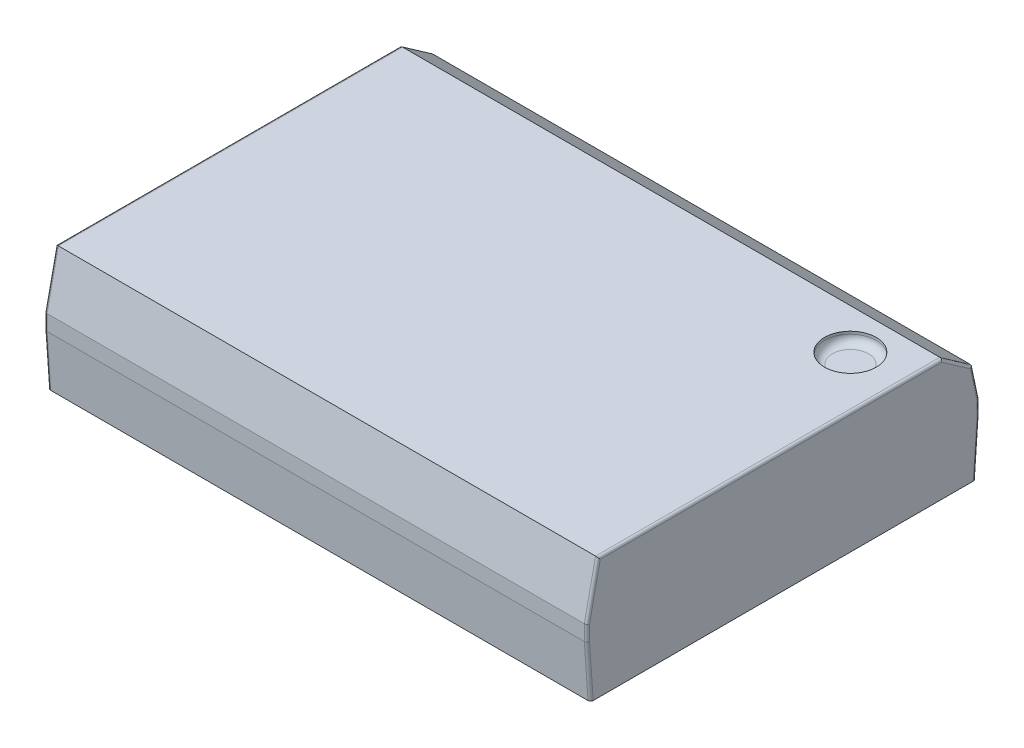
ISO-10303-21;
HEADER;
FILE_DESCRIPTION(('STEP AP214'),'2;1');
FILE_NAME('part.step','',(''),(''),'','','');
FILE_SCHEMA(('AUTOMOTIVE_DESIGN { 1 0 10303 214 1 1 1 1 }'));
ENDSEC;
DATA;
#1=APPLICATION_CONTEXT('core data for automotive mechanical design processes');
#2=APPLICATION_PROTOCOL_DEFINITION('international standard','automotive_design',2000,#1);
#3=PRODUCT_CONTEXT('',#1,'mechanical');
#4=PRODUCT('Part','Part','',(#3));
#5=PRODUCT_RELATED_PRODUCT_CATEGORY('part','',(#4));
#6=PRODUCT_DEFINITION_FORMATION('','',#4);
#7=PRODUCT_DEFINITION_CONTEXT('part definition',#1,'design');
#8=PRODUCT_DEFINITION('design','',#6,#7);
#9=PRODUCT_DEFINITION_SHAPE('','',#8);
#10=(LENGTH_UNIT() NAMED_UNIT(*) SI_UNIT(.MILLI.,.METRE.));
#11=(NAMED_UNIT(*) PLANE_ANGLE_UNIT() SI_UNIT($,.RADIAN.));
#12=(NAMED_UNIT(*) SI_UNIT($,.STERADIAN.) SOLID_ANGLE_UNIT());
#13=UNCERTAINTY_MEASURE_WITH_UNIT(LENGTH_MEASURE(1.E-05),#10,'distance_accuracy_value','');
#14=(GEOMETRIC_REPRESENTATION_CONTEXT(3) GLOBAL_UNCERTAINTY_ASSIGNED_CONTEXT((#13)) GLOBAL_UNIT_ASSIGNED_CONTEXT((#10,
#11,#12)) REPRESENTATION_CONTEXT('',''));
#15=CARTESIAN_POINT('',(0.,0.,0.));
#16=DIRECTION('',(0.,0.,1.));
#17=DIRECTION('',(1.,0.,0.));
#18=AXIS2_PLACEMENT_3D('',#15,#16,#17);
#19=CARTESIAN_POINT('',(4.25,0.975,-2.3));
#20=DIRECTION('',(0.,1.,0.));
#21=DIRECTION('',(0.,0.,1.));
#22=AXIS2_PLACEMENT_3D('',#19,#20,#21);
#23=PLANE('',#22);
#24=CARTESIAN_POINT('',(4.25,0.975,-2.3));
#25=DIRECTION('',(0.,-1.,0.));
#26=DIRECTION('',(0.,0.,-1.));
#27=AXIS2_PLACEMENT_3D('',#24,#25,#26);
#28=CIRCLE('',#27,0.350000000000003);
#29=CARTESIAN_POINT('',(4.25,0.975,-1.95));
#30=VERTEX_POINT('',#29);
#31=CARTESIAN_POINT('',(4.25,0.975,-2.65));
#32=VERTEX_POINT('',#31);
#33=EDGE_CURVE('E286',#30,#32,#28,.F.);
#34=ORIENTED_EDGE('',*,*,#33,.T.);
#35=CARTESIAN_POINT('',(4.25,0.975,-2.3));
#36=DIRECTION('',(0.,-1.,0.));
#37=DIRECTION('',(0.,0.,1.));
#38=AXIS2_PLACEMENT_3D('',#35,#36,#37);
#39=CIRCLE('',#38,0.350000000000002);
#40=EDGE_CURVE('E288',#32,#30,#39,.F.);
#41=ORIENTED_EDGE('',*,*,#40,.T.);
#42=EDGE_LOOP('',(#34,#41));
#43=FACE_BOUND('',#42,.T.);
#44=ADVANCED_FACE('F17',(#43),#23,.T.);
#45=CARTESIAN_POINT('',(4.25,1.125,-2.3));
#46=DIRECTION('',(0.,1.,0.));
#47=DIRECTION('',(0.,0.,1.));
#48=AXIS2_PLACEMENT_3D('',#45,#46,#47);
#49=TOROIDAL_SURFACE('',#48,0.350000000000003,0.15);
#50=CARTESIAN_POINT('',(4.25,1.125,-2.3));
#51=DIRECTION('',(0.,1.,0.));
#52=DIRECTION('',(0.,0.,1.));
#53=AXIS2_PLACEMENT_3D('',#50,#51,#52);
#54=CIRCLE('',#53,0.500000000000003);
#55=CARTESIAN_POINT('',(4.25,1.125,-1.8));
#56=VERTEX_POINT('',#55);
#57=EDGE_CURVE('E202',#56,#56,#54,.T.);
#58=ORIENTED_EDGE('',*,*,#57,.T.);
#59=EDGE_LOOP('',(#58));
#60=FACE_BOUND('',#59,.T.);
#61=ORIENTED_EDGE('',*,*,#40,.F.);
#62=ORIENTED_EDGE('',*,*,#33,.F.);
#63=EDGE_LOOP('',(#61,#62));
#64=FACE_BOUND('',#63,.T.);
#65=ADVANCED_FACE('F206',(#60,#64),#49,.F.);
#66=CARTESIAN_POINT('',(4.25,0.975,-2.3));
#67=DIRECTION('',(0.,1.,0.));
#68=DIRECTION('',(0.,0.,1.));
#69=AXIS2_PLACEMENT_3D('',#66,#67,#68);
#70=CYLINDRICAL_SURFACE('',#69,0.500000000000003);
#71=CARTESIAN_POINT('',(4.25,1.175,-2.3));
#72=DIRECTION('',(0.,1.,0.));
#73=DIRECTION('',(0.,0.,1.));
#74=AXIS2_PLACEMENT_3D('',#71,#72,#73);
#75=CIRCLE('',#74,0.500000000000003);
#76=CARTESIAN_POINT('',(4.25,1.175,-1.8));
#77=VERTEX_POINT('',#76);
#78=EDGE_CURVE('E189',#77,#77,#75,.F.);
#79=ORIENTED_EDGE('',*,*,#78,.F.);
#80=EDGE_LOOP('',(#79));
#81=FACE_BOUND('',#80,.T.);
#82=ORIENTED_EDGE('',*,*,#57,.F.);
#83=EDGE_LOOP('',(#82));
#84=FACE_BOUND('',#83,.T.);
#85=ADVANCED_FACE('F210',(#81,#84),#70,.F.);
#86=CARTESIAN_POINT('',(-5.25,1.175,-3.08212952428822));
#87=DIRECTION('',(0.,0.819152044288993,-0.573576436351044));
#88=DIRECTION('',(0.,0.573576436351044,0.819152044288993));
#89=AXIS2_PLACEMENT_3D('',#86,#87,#88);
#90=PLANE('',#89);
#91=DIRECTION('',(1.,0.,0.));
#92=VECTOR('',#91,1.);
#93=CARTESIAN_POINT('',(-5.25,1.175,-3.08212952428822));
#94=LINE('',#93,#92);
#95=CARTESIAN_POINT('',(5.2,1.175,-3.08212952428822));
#96=VERTEX_POINT('',#95);
#97=CARTESIAN_POINT('',(-5.2,1.175,-3.08212952428822));
#98=VERTEX_POINT('',#97);
#99=EDGE_CURVE('E186',#96,#98,#94,.F.);
#100=ORIENTED_EDGE('',*,*,#99,.F.);
#101=DIRECTION('',(0.,0.573576436351044,0.819152044288993));
#102=VECTOR('',#101,1.);
#103=CARTESIAN_POINT('',(5.2,1.175,-3.08212952428822));
#104=LINE('',#103,#102);
#105=CARTESIAN_POINT('',(5.2,0.763677592272503,-3.66955880101262));
#106=VERTEX_POINT('',#105);
#107=EDGE_CURVE('E197',#96,#106,#104,.F.);
#108=ORIENTED_EDGE('',*,*,#107,.T.);
#109=DIRECTION('',(1.,0.,0.));
#110=VECTOR('',#109,1.);
#111=CARTESIAN_POINT('',(-5.25,0.763677592272503,-3.66955880101262));
#112=LINE('',#111,#110);
#113=CARTESIAN_POINT('',(-5.2,0.763677592272503,-3.66955880101262));
#114=VERTEX_POINT('',#113);
#115=EDGE_CURVE('E194',#106,#114,#112,.F.);
#116=ORIENTED_EDGE('',*,*,#115,.T.);
#117=DIRECTION('',(0.,0.573576436351044,0.819152044288993));
#118=VECTOR('',#117,1.);
#119=CARTESIAN_POINT('',(-5.2,1.175,-3.08212952428822));
#120=LINE('',#119,#118);
#121=EDGE_CURVE('E200',#114,#98,#120,.T.);
#122=ORIENTED_EDGE('',*,*,#121,.T.);
#123=EDGE_LOOP('',(#100,#108,#116,#122));
#124=FACE_BOUND('',#123,.T.);
#125=ADVANCED_FACE('F310',(#124),#90,.T.);
#126=CARTESIAN_POINT('',(-5.25,1.175,-3.58212952428823));
#127=DIRECTION('',(0.,-0.207911690817756,0.978147600733806));
#128=DIRECTION('',(0.,-0.978147600733806,-0.207911690817756));
#129=AXIS2_PLACEMENT_3D('',#126,#127,#128);
#130=PLANE('',#129);
#131=DIRECTION('',(0.,-0.978147600733806,-0.207911690817756));
#132=VECTOR('',#131,1.);
#133=CARTESIAN_POINT('',(-5.2,1.175,-3.58212952428823));
#134=LINE('',#133,#132);
#135=CARTESIAN_POINT('',(-5.2,0.149999999999984,-3.8));
#136=VERTEX_POINT('',#135);
#137=EDGE_CURVE('E192',#114,#136,#134,.T.);
#138=ORIENTED_EDGE('',*,*,#137,.F.);
#139=ORIENTED_EDGE('',*,*,#115,.F.);
#140=DIRECTION('',(0.,-0.978147600733806,-0.207911690817756));
#141=VECTOR('',#140,1.);
#142=CARTESIAN_POINT('',(5.2,-1.11772386568823,-4.06946302603771));
#143=LINE('',#142,#141);
#144=CARTESIAN_POINT('',(5.2,0.149999999999983,-3.8));
#145=VERTEX_POINT('',#144);
#146=EDGE_CURVE('E159',#145,#106,#143,.F.);
#147=ORIENTED_EDGE('',*,*,#146,.F.);
#148=DIRECTION('',(-1.,0.,0.));
#149=VECTOR('',#148,1.);
#150=CARTESIAN_POINT('',(-5.25,0.149999999999983,-3.8));
#151=LINE('',#150,#149);
#152=EDGE_CURVE('E181',#136,#145,#151,.F.);
#153=ORIENTED_EDGE('',*,*,#152,.F.);
#154=EDGE_LOOP('',(#138,#139,#147,#153));
#155=FACE_BOUND('',#154,.T.);
#156=ADVANCED_FACE('F316',(#155),#130,.F.);
#157=CARTESIAN_POINT('',(-5.25,1.175,3.8));
#158=DIRECTION('',(0.,1.,0.));
#159=DIRECTION('',(0.,0.,1.));
#160=AXIS2_PLACEMENT_3D('',#157,#158,#159);
#161=PLANE('',#160);
#162=DIRECTION('',(1.,0.,0.));
#163=VECTOR('',#162,1.);
#164=CARTESIAN_POINT('',(-5.25,1.175,3.58212952428823));
#165=LINE('',#164,#163);
#166=CARTESIAN_POINT('',(-5.2,1.175,3.58212952428823));
#167=VERTEX_POINT('',#166);
#168=CARTESIAN_POINT('',(5.2,1.175,3.58212952428823));
#169=VERTEX_POINT('',#168);
#170=EDGE_CURVE('E175',#167,#169,#165,.T.);
#171=ORIENTED_EDGE('',*,*,#170,.T.);
#172=DIRECTION('',(0.,0.,-1.));
#173=VECTOR('',#172,1.);
#174=CARTESIAN_POINT('',(5.2,1.175,3.8));
#175=LINE('',#174,#173);
#176=EDGE_CURVE('E171',#96,#169,#175,.F.);
#177=ORIENTED_EDGE('',*,*,#176,.F.);
#178=ORIENTED_EDGE('',*,*,#99,.T.);
#179=DIRECTION('',(0.,0.,1.));
#180=VECTOR('',#179,1.);
#181=CARTESIAN_POINT('',(-5.2,1.175,3.8));
#182=LINE('',#181,#180);
#183=EDGE_CURVE('E268',#167,#98,#182,.F.);
#184=ORIENTED_EDGE('',*,*,#183,.F.);
#185=EDGE_LOOP('',(#171,#177,#178,#184));
#186=FACE_BOUND('',#185,.T.);
#187=ORIENTED_EDGE('',*,*,#78,.T.);
#188=EDGE_LOOP('',(#187));
#189=FACE_BOUND('',#188,.T.);
#190=ADVANCED_FACE('F411',(#186,#189),#161,.T.);
#191=CARTESIAN_POINT('',(-5.25,1.175,3.58212952428823));
#192=DIRECTION('',(0.,-0.207911690817756,-0.978147600733806));
#193=DIRECTION('',(0.,0.978147600733806,-0.207911690817756));
#194=AXIS2_PLACEMENT_3D('',#191,#192,#193);
#195=PLANE('',#194);
#196=DIRECTION('',(0.,-0.978147600733806,0.207911690817756));
#197=VECTOR('',#196,1.);
#198=CARTESIAN_POINT('',(-5.2,0.427875377999794,3.7409357650796));
#199=LINE('',#198,#197);
#200=CARTESIAN_POINT('',(-5.2,0.149999999999984,3.8));
#201=VERTEX_POINT('',#200);
#202=EDGE_CURVE('E272',#201,#167,#199,.F.);
#203=ORIENTED_EDGE('',*,*,#202,.F.);
#204=DIRECTION('',(1.,0.,0.));
#205=VECTOR('',#204,1.);
#206=CARTESIAN_POINT('',(-5.25,0.149999999999983,3.8));
#207=LINE('',#206,#205);
#208=CARTESIAN_POINT('',(5.2,0.149999999999984,3.8));
#209=VERTEX_POINT('',#208);
#210=EDGE_CURVE('E176',#209,#201,#207,.F.);
#211=ORIENTED_EDGE('',*,*,#210,.F.);
#212=DIRECTION('',(0.,0.978147600733806,-0.207911690817756));
#213=VECTOR('',#212,1.);
#214=CARTESIAN_POINT('',(5.2,0.427875377999794,3.7409357650796));
#215=LINE('',#214,#213);
#216=EDGE_CURVE('E274',#169,#209,#215,.F.);
#217=ORIENTED_EDGE('',*,*,#216,.F.);
#218=ORIENTED_EDGE('',*,*,#170,.F.);
#219=EDGE_LOOP('',(#203,#211,#217,#218));
#220=FACE_BOUND('',#219,.T.);
#221=ADVANCED_FACE('F407',(#220),#195,.F.);
#222=CARTESIAN_POINT('',(5.2,-1.175,3.75));
#223=DIRECTION('',(0.,1.,0.));
#224=DIRECTION('',(0.,0.,1.));
#225=AXIS2_PLACEMENT_3D('',#222,#223,#224);
#226=CYLINDRICAL_SURFACE('',#225,0.0500000000000001);
#227=CARTESIAN_POINT('',(5.2,0.144744788236702,3.75));
#228=DIRECTION('',(0.,0.994521895368274,-0.104528463267652));
#229=DIRECTION('',(0.,-0.104528463267652,-0.994521895368274));
#230=AXIS2_PLACEMENT_3D('',#227,#228,#229);
#231=ELLIPSE('',#230,0.0502754139781759,0.0500000000000001);
#232=CARTESIAN_POINT('',(5.25,0.144744788236702,3.75));
#233=VERTEX_POINT('',#232);
#234=EDGE_CURVE('E278',#209,#233,#231,.T.);
#235=ORIENTED_EDGE('',*,*,#234,.F.);
#236=DIRECTION('',(0.,1.,0.));
#237=VECTOR('',#236,1.);
#238=CARTESIAN_POINT('',(5.2,-1.175,3.8));
#239=LINE('',#238,#237);
#240=CARTESIAN_POINT('',(5.2,-0.149999999999954,3.8));
#241=VERTEX_POINT('',#240);
#242=EDGE_CURVE('E256',#241,#209,#239,.T.);
#243=ORIENTED_EDGE('',*,*,#242,.F.);
#244=CARTESIAN_POINT('',(5.2,-0.148253961525354,3.75));
#245=DIRECTION('',(0.,-0.999390827019096,-0.0348994967024994));
#246=DIRECTION('',(0.,0.0348994967024985,-0.999390827019096));
#247=AXIS2_PLACEMENT_3D('',#244,#245,#246);
#248=ELLIPSE('',#247,0.0500304772149412,0.0500000000000001);
#249=CARTESIAN_POINT('',(5.25,-0.148253961525402,3.75));
#250=VERTEX_POINT('',#249);
#251=EDGE_CURVE('E253',#250,#241,#248,.T.);
#252=ORIENTED_EDGE('',*,*,#251,.F.);
#253=DIRECTION('',(0.,1.,0.));
#254=VECTOR('',#253,1.);
#255=CARTESIAN_POINT('',(5.25,-1.175,3.75));
#256=LINE('',#255,#254);
#257=EDGE_CURVE('E255',#233,#250,#256,.F.);
#258=ORIENTED_EDGE('',*,*,#257,.F.);
#259=EDGE_LOOP('',(#235,#243,#252,#258));
#260=FACE_BOUND('',#259,.T.);
#261=ADVANCED_FACE('F404',(#260),#226,.T.);
#262=CARTESIAN_POINT('',(5.2,-1.12811945022911,-4.02055564600102));
#263=DIRECTION('',(0.,-0.978147600733806,-0.207911690817756));
#264=DIRECTION('',(0.,0.207911690817756,-0.978147600733806));
#265=AXIS2_PLACEMENT_3D('',#262,#263,#264);
#266=CYLINDRICAL_SURFACE('',#265,0.0500000000000001);
#267=CARTESIAN_POINT('',(5.2,0.734016878400281,-3.62474635062672));
#268=DIRECTION('',(0.,0.833885822067168,0.551936985312058));
#269=DIRECTION('',(0.,-0.551936985312058,0.833885822067168));
#270=AXIS2_PLACEMENT_3D('',#267,#268,#269);
#271=ELLIPSE('',#270,0.0537393120257227,0.0500000000000001);
#272=CARTESIAN_POINT('',(5.25,0.734016878400281,-3.62474635062672));
#273=VERTEX_POINT('',#272);
#274=EDGE_CURVE('E157',#273,#106,#271,.T.);
#275=ORIENTED_EDGE('',*,*,#274,.F.);
#276=DIRECTION('',(0.,0.978147600733806,0.207911690817757));
#277=VECTOR('',#276,1.);
#278=CARTESIAN_POINT('',(5.25,0.1447447882367,-3.75));
#279=LINE('',#278,#277);
#280=CARTESIAN_POINT('',(5.25,0.144744788236699,-3.75));
#281=VERTEX_POINT('',#280);
#282=EDGE_CURVE('E143',#281,#273,#279,.T.);
#283=ORIENTED_EDGE('',*,*,#282,.F.);
#284=CARTESIAN_POINT('',(5.2,0.1447447882367,-3.75));
#285=DIRECTION('',(0.,0.994521895368274,0.104528463267652));
#286=DIRECTION('',(0.,0.104528463267652,-0.994521895368274));
#287=AXIS2_PLACEMENT_3D('',#284,#285,#286);
#288=ELLIPSE('',#287,0.0502754139781759,0.0500000000000001);
#289=EDGE_CURVE('E185',#145,#281,#288,.F.);
#290=ORIENTED_EDGE('',*,*,#289,.F.);
#291=ORIENTED_EDGE('',*,*,#146,.T.);
#292=EDGE_LOOP('',(#275,#283,#290,#291));
#293=FACE_BOUND('',#292,.T.);
#294=ADVANCED_FACE('F158',(#293),#266,.T.);
#295=CARTESIAN_POINT('',(5.2,0.023627271840003,-4.6392878512461));
#296=DIRECTION('',(0.,0.573576436351044,0.819152044288993));
#297=DIRECTION('',(0.,-0.819152044288993,0.573576436351044));
#298=AXIS2_PLACEMENT_3D('',#295,#296,#297);
#299=CYLINDRICAL_SURFACE('',#298,0.05);
#300=CARTESIAN_POINT('',(5.2,1.125,-3.06636458484427));
#301=DIRECTION('',(0.,-0.300705799504272,-0.953716950748227));
#302=DIRECTION('',(0.,0.953716950748227,-0.300705799504272));
#303=AXIS2_PLACEMENT_3D('',#300,#301,#302);
#304=ELLIPSE('',#303,0.0524264562570404,0.0499999999999999);
#305=CARTESIAN_POINT('',(5.25,1.125,-3.06636458484427));
#306=VERTEX_POINT('',#305);
#307=EDGE_CURVE('E161',#306,#96,#304,.F.);
#308=ORIENTED_EDGE('',*,*,#307,.F.);
#309=DIRECTION('',(0.,0.573576436351045,0.819152044288993));
#310=VECTOR('',#309,1.);
#311=CARTESIAN_POINT('',(5.25,0.734016878400281,-3.62474635062672));
#312=LINE('',#311,#310);
#313=EDGE_CURVE('E147',#273,#306,#312,.T.);
#314=ORIENTED_EDGE('',*,*,#313,.F.);
#315=ORIENTED_EDGE('',*,*,#274,.T.);
#316=ORIENTED_EDGE('',*,*,#107,.F.);
#317=EDGE_LOOP('',(#308,#314,#315,#316));
#318=FACE_BOUND('',#317,.T.);
#319=ADVANCED_FACE('F163',(#318),#299,.T.);
#320=CARTESIAN_POINT('',(5.2,1.125,3.8));
#321=DIRECTION('',(0.,0.,-1.));
#322=DIRECTION('',(-1.,0.,0.));
#323=AXIS2_PLACEMENT_3D('',#320,#321,#322);
#324=CYLINDRICAL_SURFACE('',#323,0.0499999999999997);
#325=ORIENTED_EDGE('',*,*,#307,.T.);
#326=ORIENTED_EDGE('',*,*,#176,.T.);
#327=CARTESIAN_POINT('',(5.2,1.125,3.54164032262848));
#328=DIRECTION('',(0.,0.629320391049839,-0.77714596145697));
#329=DIRECTION('',(0.,0.77714596145697,0.629320391049839));
#330=AXIS2_PLACEMENT_3D('',#327,#328,#329);
#331=ELLIPSE('',#330,0.0643379782946583,0.0499999999999999);
#332=CARTESIAN_POINT('',(5.25,1.125,3.54164032262848));
#333=VERTEX_POINT('',#332);
#334=EDGE_CURVE('E275',#333,#169,#331,.F.);
#335=ORIENTED_EDGE('',*,*,#334,.F.);
#336=DIRECTION('',(0.,0.,-1.));
#337=VECTOR('',#336,1.);
#338=CARTESIAN_POINT('',(5.25,1.125,-3.8));
#339=LINE('',#338,#337);
#340=EDGE_CURVE('E166',#306,#333,#339,.F.);
#341=ORIENTED_EDGE('',*,*,#340,.F.);
#342=EDGE_LOOP('',(#325,#326,#335,#341));
#343=FACE_BOUND('',#342,.T.);
#344=ADVANCED_FACE('F395',(#343),#324,.T.);
#345=CARTESIAN_POINT('',(5.2,0.417479793458907,3.69202838504291));
#346=DIRECTION('',(0.,0.978147600733806,-0.207911690817756));
#347=DIRECTION('',(0.,0.207911690817756,0.978147600733806));
#348=AXIS2_PLACEMENT_3D('',#345,#346,#347);
#349=CYLINDRICAL_SURFACE('',#348,0.0500000000000001);
#350=ORIENTED_EDGE('',*,*,#334,.T.);
#351=ORIENTED_EDGE('',*,*,#216,.T.);
#352=ORIENTED_EDGE('',*,*,#234,.T.);
#353=DIRECTION('',(0.,-0.978147600733806,0.207911690817756));
#354=VECTOR('',#353,1.);
#355=CARTESIAN_POINT('',(5.25,1.125,3.54164032262848));
#356=LINE('',#355,#354);
#357=EDGE_CURVE('E168',#333,#233,#356,.T.);
#358=ORIENTED_EDGE('',*,*,#357,.F.);
#359=EDGE_LOOP('',(#350,#351,#352,#358));
#360=FACE_BOUND('',#359,.T.);
#361=ADVANCED_FACE('F391',(#360),#349,.T.);
#362=CARTESIAN_POINT('',(5.2,-1.175,-3.75));
#363=DIRECTION('',(0.,1.,0.));
#364=DIRECTION('',(0.,0.,1.));
#365=AXIS2_PLACEMENT_3D('',#362,#363,#364);
#366=CYLINDRICAL_SURFACE('',#365,0.0500000000000001);
#367=ORIENTED_EDGE('',*,*,#289,.T.);
#368=DIRECTION('',(0.,1.,0.));
#369=VECTOR('',#368,1.);
#370=CARTESIAN_POINT('',(5.25,-1.175,-3.75));
#371=LINE('',#370,#369);
#372=CARTESIAN_POINT('',(5.25,-0.148253961525356,-3.75));
#373=VERTEX_POINT('',#372);
#374=EDGE_CURVE('E151',#373,#281,#371,.T.);
#375=ORIENTED_EDGE('',*,*,#374,.F.);
#376=CARTESIAN_POINT('',(5.2,-0.148253961525357,-3.75));
#377=DIRECTION('',(0.,0.999390827019096,-0.0348994967024992));
#378=DIRECTION('',(0.,-0.0348994967024987,-0.999390827019096));
#379=AXIS2_PLACEMENT_3D('',#376,#377,#378);
#380=ELLIPSE('',#379,0.0500304772149412,0.0500000000000001);
#381=CARTESIAN_POINT('',(5.2,-0.149999999999949,-3.8));
#382=VERTEX_POINT('',#381);
#383=EDGE_CURVE('E250',#382,#373,#380,.F.);
#384=ORIENTED_EDGE('',*,*,#383,.F.);
#385=DIRECTION('',(0.,1.,0.));
#386=VECTOR('',#385,1.);
#387=CARTESIAN_POINT('',(5.2,-1.175,-3.8));
#388=LINE('',#387,#386);
#389=EDGE_CURVE('E184',#145,#382,#388,.F.);
#390=ORIENTED_EDGE('',*,*,#389,.F.);
#391=EDGE_LOOP('',(#367,#375,#384,#390));
#392=FACE_BOUND('',#391,.T.);
#393=ADVANCED_FACE('F387',(#392),#366,.T.);
#394=CARTESIAN_POINT('',(-5.25,-1.175,-3.8));
#395=DIRECTION('',(0.,0.,-1.));
#396=DIRECTION('',(-1.,0.,0.));
#397=AXIS2_PLACEMENT_3D('',#394,#395,#396);
#398=PLANE('',#397);
#399=ORIENTED_EDGE('',*,*,#152,.T.);
#400=ORIENTED_EDGE('',*,*,#389,.T.);
#401=DIRECTION('',(1.,0.,0.));
#402=VECTOR('',#401,1.);
#403=CARTESIAN_POINT('',(-5.25,-0.149999999999946,-3.8));
#404=LINE('',#403,#402);
#405=CARTESIAN_POINT('',(-5.2,-0.149999999999945,-3.8));
#406=VERTEX_POINT('',#405);
#407=EDGE_CURVE('E446',#406,#382,#404,.T.);
#408=ORIENTED_EDGE('',*,*,#407,.F.);
#409=DIRECTION('',(0.,1.,0.));
#410=VECTOR('',#409,1.);
#411=CARTESIAN_POINT('',(-5.2,-1.175,-3.8));
#412=LINE('',#411,#410);
#413=EDGE_CURVE('E258',#136,#406,#412,.F.);
#414=ORIENTED_EDGE('',*,*,#413,.F.);
#415=EDGE_LOOP('',(#399,#400,#408,#414));
#416=FACE_BOUND('',#415,.T.);
#417=ADVANCED_FACE('F383',(#416),#398,.T.);
#418=CARTESIAN_POINT('',(-5.2,0.417479793458907,3.69202838504291));
#419=DIRECTION('',(0.,-0.978147600733806,0.207911690817756));
#420=DIRECTION('',(0.,-0.207911690817756,-0.978147600733806));
#421=AXIS2_PLACEMENT_3D('',#418,#419,#420);
#422=CYLINDRICAL_SURFACE('',#421,0.0500000000000001);
#423=CARTESIAN_POINT('',(-5.2,1.125,3.54164032262848));
#424=DIRECTION('',(0.,-0.629320391049839,0.77714596145697));
#425=DIRECTION('',(0.,0.77714596145697,0.629320391049839));
#426=AXIS2_PLACEMENT_3D('',#423,#424,#425);
#427=ELLIPSE('',#426,0.0643379782946583,0.0499999999999999);
#428=CARTESIAN_POINT('',(-5.25,1.125,3.54164032262848));
#429=VERTEX_POINT('',#428);
#430=EDGE_CURVE('E269',#429,#167,#427,.F.);
#431=ORIENTED_EDGE('',*,*,#430,.F.);
#432=DIRECTION('',(0.,0.978147600733806,-0.207911690817757));
#433=VECTOR('',#432,1.);
#434=CARTESIAN_POINT('',(-5.25,0.144744788236702,3.75));
#435=LINE('',#434,#433);
#436=CARTESIAN_POINT('',(-5.25,0.144744788236697,3.75));
#437=VERTEX_POINT('',#436);
#438=EDGE_CURVE('E451',#437,#429,#435,.T.);
#439=ORIENTED_EDGE('',*,*,#438,.F.);
#440=CARTESIAN_POINT('',(-5.2,0.144744788236699,3.75));
#441=DIRECTION('',(0.,0.994521895368274,-0.104528463267652));
#442=DIRECTION('',(0.,0.104528463267652,0.994521895368274));
#443=AXIS2_PLACEMENT_3D('',#440,#441,#442);
#444=ELLIPSE('',#443,0.0502754139781759,0.0500000000000001);
#445=EDGE_CURVE('E180',#201,#437,#444,.F.);
#446=ORIENTED_EDGE('',*,*,#445,.F.);
#447=ORIENTED_EDGE('',*,*,#202,.T.);
#448=EDGE_LOOP('',(#431,#439,#446,#447));
#449=FACE_BOUND('',#448,.T.);
#450=ADVANCED_FACE('F379',(#449),#422,.T.);
#451=CARTESIAN_POINT('',(-5.2,1.125,3.8));
#452=DIRECTION('',(0.,0.,1.));
#453=DIRECTION('',(1.,0.,0.));
#454=AXIS2_PLACEMENT_3D('',#451,#452,#453);
#455=CYLINDRICAL_SURFACE('',#454,0.0499999999999997);
#456=ORIENTED_EDGE('',*,*,#430,.T.);
#457=ORIENTED_EDGE('',*,*,#183,.T.);
#458=CARTESIAN_POINT('',(-5.2,1.125,-3.06636458484427));
#459=DIRECTION('',(0.,-0.300705799504272,-0.953716950748227));
#460=DIRECTION('',(0.,-0.953716950748227,0.300705799504272));
#461=AXIS2_PLACEMENT_3D('',#458,#459,#460);
#462=ELLIPSE('',#461,0.0524264562570404,0.0499999999999999);
#463=CARTESIAN_POINT('',(-5.25,1.125,-3.06636458484427));
#464=VERTEX_POINT('',#463);
#465=EDGE_CURVE('E265',#464,#98,#462,.T.);
#466=ORIENTED_EDGE('',*,*,#465,.F.);
#467=DIRECTION('',(0.,0.,1.));
#468=VECTOR('',#467,1.);
#469=CARTESIAN_POINT('',(-5.25,1.125,-3.8));
#470=LINE('',#469,#468);
#471=EDGE_CURVE('E453',#429,#464,#470,.F.);
#472=ORIENTED_EDGE('',*,*,#471,.F.);
#473=EDGE_LOOP('',(#456,#457,#466,#472));
#474=FACE_BOUND('',#473,.T.);
#475=ADVANCED_FACE('F375',(#474),#455,.T.);
#476=CARTESIAN_POINT('',(-5.2,0.023627271840003,-4.6392878512461));
#477=DIRECTION('',(0.,-0.573576436351044,-0.819152044288993));
#478=DIRECTION('',(0.,0.819152044288993,-0.573576436351044));
#479=AXIS2_PLACEMENT_3D('',#476,#477,#478);
#480=CYLINDRICAL_SURFACE('',#479,0.05);
#481=ORIENTED_EDGE('',*,*,#465,.T.);
#482=ORIENTED_EDGE('',*,*,#121,.F.);
#483=CARTESIAN_POINT('',(-5.2,0.734016878400281,-3.62474635062672));
#484=DIRECTION('',(0.,0.833885822067168,0.551936985312058));
#485=DIRECTION('',(0.,0.551936985312058,-0.833885822067168));
#486=AXIS2_PLACEMENT_3D('',#483,#484,#485);
#487=ELLIPSE('',#486,0.0537393120257227,0.0500000000000001);
#488=CARTESIAN_POINT('',(-5.25,0.734016878400281,-3.62474635062672));
#489=VERTEX_POINT('',#488);
#490=EDGE_CURVE('E262',#489,#114,#487,.F.);
#491=ORIENTED_EDGE('',*,*,#490,.F.);
#492=DIRECTION('',(0.,-0.573576436351044,-0.819152044288993));
#493=VECTOR('',#492,1.);
#494=CARTESIAN_POINT('',(-5.25,1.125,-3.06636458484427));
#495=LINE('',#494,#493);
#496=EDGE_CURVE('E458',#464,#489,#495,.T.);
#497=ORIENTED_EDGE('',*,*,#496,.F.);
#498=EDGE_LOOP('',(#481,#482,#491,#497));
#499=FACE_BOUND('',#498,.T.);
#500=ADVANCED_FACE('F371',(#499),#480,.T.);
#501=CARTESIAN_POINT('',(-5.2,-1.12811945022911,-4.02055564600102));
#502=DIRECTION('',(0.,0.978147600733806,0.207911690817756));
#503=DIRECTION('',(0.,-0.207911690817756,0.978147600733806));
#504=AXIS2_PLACEMENT_3D('',#501,#502,#503);
#505=CYLINDRICAL_SURFACE('',#504,0.0500000000000001);
#506=ORIENTED_EDGE('',*,*,#490,.T.);
#507=ORIENTED_EDGE('',*,*,#137,.T.);
#508=CARTESIAN_POINT('',(-5.2,0.1447447882367,-3.75));
#509=DIRECTION('',(0.,0.994521895368274,0.104528463267652));
#510=DIRECTION('',(0.,0.104528463267652,-0.994521895368274));
#511=AXIS2_PLACEMENT_3D('',#508,#509,#510);
#512=ELLIPSE('',#511,0.0502754139781759,0.0500000000000001);
#513=CARTESIAN_POINT('',(-5.25,0.1447447882367,-3.75));
#514=VERTEX_POINT('',#513);
#515=EDGE_CURVE('E259',#514,#136,#512,.F.);
#516=ORIENTED_EDGE('',*,*,#515,.F.);
#517=DIRECTION('',(0.,-0.978147600733806,-0.207911690817757));
#518=VECTOR('',#517,1.);
#519=CARTESIAN_POINT('',(-5.25,0.734016878400281,-3.62474635062672));
#520=LINE('',#519,#518);
#521=EDGE_CURVE('E427',#489,#514,#520,.T.);
#522=ORIENTED_EDGE('',*,*,#521,.F.);
#523=EDGE_LOOP('',(#506,#507,#516,#522));
#524=FACE_BOUND('',#523,.T.);
#525=ADVANCED_FACE('F367',(#524),#505,.T.);
#526=CARTESIAN_POINT('',(-5.2,-1.175,-3.75));
#527=DIRECTION('',(0.,1.,0.));
#528=DIRECTION('',(0.,0.,1.));
#529=AXIS2_PLACEMENT_3D('',#526,#527,#528);
#530=CYLINDRICAL_SURFACE('',#529,0.0500000000000001);
#531=ORIENTED_EDGE('',*,*,#515,.T.);
#532=ORIENTED_EDGE('',*,*,#413,.T.);
#533=CARTESIAN_POINT('',(-5.2,-0.148253961525357,-3.75));
#534=DIRECTION('',(0.,-0.999390827019096,0.0348994967024992));
#535=DIRECTION('',(0.,0.0348994967024987,0.999390827019096));
#536=AXIS2_PLACEMENT_3D('',#533,#534,#535);
#537=ELLIPSE('',#536,0.0500304772149412,0.0500000000000001);
#538=CARTESIAN_POINT('',(-5.25,-0.148253961525384,-3.75));
#539=VERTEX_POINT('',#538);
#540=EDGE_CURVE('E245',#539,#406,#537,.T.);
#541=ORIENTED_EDGE('',*,*,#540,.F.);
#542=DIRECTION('',(0.,1.,0.));
#543=VECTOR('',#542,1.);
#544=CARTESIAN_POINT('',(-5.25,-1.175,-3.75));
#545=LINE('',#544,#543);
#546=EDGE_CURVE('E461',#514,#539,#545,.F.);
#547=ORIENTED_EDGE('',*,*,#546,.F.);
#548=EDGE_LOOP('',(#531,#532,#541,#547));
#549=FACE_BOUND('',#548,.T.);
#550=ADVANCED_FACE('F363',(#549),#530,.T.);
#551=CARTESIAN_POINT('',(-5.2,-1.175,3.75));
#552=DIRECTION('',(0.,1.,0.));
#553=DIRECTION('',(0.,0.,1.));
#554=AXIS2_PLACEMENT_3D('',#551,#552,#553);
#555=CYLINDRICAL_SURFACE('',#554,0.0500000000000001);
#556=ORIENTED_EDGE('',*,*,#445,.T.);
#557=DIRECTION('',(0.,1.,0.));
#558=VECTOR('',#557,1.);
#559=CARTESIAN_POINT('',(-5.25,-1.175,3.75));
#560=LINE('',#559,#558);
#561=CARTESIAN_POINT('',(-5.25,-0.148253961525379,3.75));
#562=VERTEX_POINT('',#561);
#563=EDGE_CURVE('E454',#562,#437,#560,.T.);
#564=ORIENTED_EDGE('',*,*,#563,.F.);
#565=CARTESIAN_POINT('',(-5.2,-0.148253961525377,3.75));
#566=DIRECTION('',(0.,0.999390827019096,0.0348994967024994));
#567=DIRECTION('',(0.,-0.0348994967024985,0.999390827019096));
#568=AXIS2_PLACEMENT_3D('',#565,#566,#567);
#569=ELLIPSE('',#568,0.0500304772149412,0.0500000000000001);
#570=CARTESIAN_POINT('',(-5.2,-0.149999999999956,3.8));
#571=VERTEX_POINT('',#570);
#572=EDGE_CURVE('E241',#571,#562,#569,.F.);
#573=ORIENTED_EDGE('',*,*,#572,.F.);
#574=DIRECTION('',(0.,1.,0.));
#575=VECTOR('',#574,1.);
#576=CARTESIAN_POINT('',(-5.2,-1.175,3.8));
#577=LINE('',#576,#575);
#578=EDGE_CURVE('E179',#201,#571,#577,.F.);
#579=ORIENTED_EDGE('',*,*,#578,.F.);
#580=EDGE_LOOP('',(#556,#564,#573,#579));
#581=FACE_BOUND('',#580,.T.);
#582=ADVANCED_FACE('F359',(#581),#555,.T.);
#583=CARTESIAN_POINT('',(-5.25,-1.175,3.8));
#584=DIRECTION('',(0.,0.,1.));
#585=DIRECTION('',(1.,0.,0.));
#586=AXIS2_PLACEMENT_3D('',#583,#584,#585);
#587=PLANE('',#586);
#588=DIRECTION('',(1.,0.,0.));
#589=VECTOR('',#588,1.);
#590=CARTESIAN_POINT('',(-5.25,-0.149999999999946,3.8));
#591=LINE('',#590,#589);
#592=EDGE_CURVE('E469',#241,#571,#591,.F.);
#593=ORIENTED_EDGE('',*,*,#592,.F.);
#594=ORIENTED_EDGE('',*,*,#242,.T.);
#595=ORIENTED_EDGE('',*,*,#210,.T.);
#596=ORIENTED_EDGE('',*,*,#578,.T.);
#597=EDGE_LOOP('',(#593,#594,#595,#596));
#598=FACE_BOUND('',#597,.T.);
#599=ADVANCED_FACE('F355',(#598),#587,.T.);
#600=CARTESIAN_POINT('',(5.2,-1.69538234519107,3.64181424446295));
#601=DIRECTION('',(0.,-0.997564050259825,-0.0697564737441222));
#602=DIRECTION('',(0.,0.0697564737441222,-0.997564050259825));
#603=AXIS2_PLACEMENT_3D('',#600,#601,#602);
#604=CYLINDRICAL_SURFACE('',#603,0.0500000000000001);
#605=ORIENTED_EDGE('',*,*,#251,.T.);
#606=DIRECTION('',(0.,-0.997564050259825,-0.0697564737441222));
#607=VECTOR('',#606,1.);
#608=CARTESIAN_POINT('',(5.2,-0.149999999999946,3.8));
#609=LINE('',#608,#607);
#610=CARTESIAN_POINT('',(5.2,-1.175,3.7283250177579));
#611=VERTEX_POINT('',#610);
#612=EDGE_CURVE('E240',#611,#241,#609,.F.);
#613=ORIENTED_EDGE('',*,*,#612,.F.);
#614=CARTESIAN_POINT('',(5.2,-1.175,3.67820292285384));
#615=DIRECTION('',(0.,1.,0.));
#616=DIRECTION('',(0.,0.,-1.));
#617=AXIS2_PLACEMENT_3D('',#614,#615,#616);
#618=ELLIPSE('',#617,0.0501220949040587,0.0500000000000001);
#619=CARTESIAN_POINT('',(5.25,-1.175,3.67820292285384));
#620=VERTEX_POINT('',#619);
#621=EDGE_CURVE('E237',#611,#620,#618,.T.);
#622=ORIENTED_EDGE('',*,*,#621,.T.);
#623=DIRECTION('',(0.,-0.997564050259825,-0.069756473744123));
#624=VECTOR('',#623,1.);
#625=CARTESIAN_POINT('',(5.25,-0.148253961525365,3.75));
#626=LINE('',#625,#624);
#627=EDGE_CURVE('E440',#250,#620,#626,.T.);
#628=ORIENTED_EDGE('',*,*,#627,.F.);
#629=EDGE_LOOP('',(#605,#613,#622,#628));
#630=FACE_BOUND('',#629,.T.);
#631=ADVANCED_FACE('F352',(#630),#604,.T.);
#632=CARTESIAN_POINT('',(5.25,-1.175,-3.8));
#633=DIRECTION('',(1.,0.,0.));
#634=DIRECTION('',(0.,0.,-1.));
#635=AXIS2_PLACEMENT_3D('',#632,#633,#634);
#636=PLANE('',#635);
#637=ORIENTED_EDGE('',*,*,#340,.T.);
#638=ORIENTED_EDGE('',*,*,#357,.T.);
#639=ORIENTED_EDGE('',*,*,#257,.T.);
#640=ORIENTED_EDGE('',*,*,#627,.T.);
#641=DIRECTION('',(0.,0.,1.));
#642=VECTOR('',#641,1.);
#643=CARTESIAN_POINT('',(5.25,-1.175,3.8));
#644=LINE('',#643,#642);
#645=CARTESIAN_POINT('',(5.25,-1.175,-3.67820292285384));
#646=VERTEX_POINT('',#645);
#647=EDGE_CURVE('E236',#620,#646,#644,.F.);
#648=ORIENTED_EDGE('',*,*,#647,.T.);
#649=DIRECTION('',(0.,0.997564050259825,-0.0697564737441218));
#650=VECTOR('',#649,1.);
#651=CARTESIAN_POINT('',(5.25,-1.16652456154285,-3.67879558324497));
#652=LINE('',#651,#650);
#653=EDGE_CURVE('E252',#373,#646,#652,.F.);
#654=ORIENTED_EDGE('',*,*,#653,.F.);
#655=ORIENTED_EDGE('',*,*,#374,.T.);
#656=ORIENTED_EDGE('',*,*,#282,.T.);
#657=ORIENTED_EDGE('',*,*,#313,.T.);
#658=EDGE_LOOP('',(#637,#638,#639,#640,#648,#654,#655,#656,#657));
#659=FACE_BOUND('',#658,.T.);
#660=ADVANCED_FACE('F145',(#659),#636,.T.);
#661=CARTESIAN_POINT('',(5.2,-1.16652456154285,-3.67879558324497));
#662=DIRECTION('',(0.,0.997564050259825,-0.0697564737441218));
#663=DIRECTION('',(0.,0.0697564737441218,0.997564050259825));
#664=AXIS2_PLACEMENT_3D('',#661,#662,#663);
#665=CYLINDRICAL_SURFACE('',#664,0.0500000000000001);
#666=ORIENTED_EDGE('',*,*,#383,.T.);
#667=ORIENTED_EDGE('',*,*,#653,.T.);
#668=CARTESIAN_POINT('',(5.2,-1.175,-3.67820292285384));
#669=DIRECTION('',(0.,1.,0.));
#670=DIRECTION('',(0.,0.,-1.));
#671=AXIS2_PLACEMENT_3D('',#668,#669,#670);
#672=ELLIPSE('',#671,0.0501220949040587,0.0500000000000001);
#673=CARTESIAN_POINT('',(5.2,-1.175,-3.7283250177579));
#674=VERTEX_POINT('',#673);
#675=EDGE_CURVE('E233',#646,#674,#672,.T.);
#676=ORIENTED_EDGE('',*,*,#675,.T.);
#677=DIRECTION('',(0.,0.997564050259825,-0.0697564737441218));
#678=VECTOR('',#677,1.);
#679=CARTESIAN_POINT('',(5.2,-0.149999999999946,-3.8));
#680=LINE('',#679,#678);
#681=EDGE_CURVE('E249',#382,#674,#680,.F.);
#682=ORIENTED_EDGE('',*,*,#681,.F.);
#683=EDGE_LOOP('',(#666,#667,#676,#682));
#684=FACE_BOUND('',#683,.T.);
#685=ADVANCED_FACE('F345',(#684),#665,.T.);
#686=CARTESIAN_POINT('',(-5.25,-0.149999999999946,-3.8));
#687=DIRECTION('',(0.,-0.0697564737441218,-0.997564050259825));
#688=DIRECTION('',(0.,0.997564050259825,-0.0697564737441218));
#689=AXIS2_PLACEMENT_3D('',#686,#687,#688);
#690=PLANE('',#689);
#691=ORIENTED_EDGE('',*,*,#407,.T.);
#692=ORIENTED_EDGE('',*,*,#681,.T.);
#693=DIRECTION('',(1.,0.,0.));
#694=VECTOR('',#693,1.);
#695=CARTESIAN_POINT('',(-5.25,-1.175,-3.7283250177579));
#696=LINE('',#695,#694);
#697=CARTESIAN_POINT('',(-5.2,-1.175,-3.7283250177579));
#698=VERTEX_POINT('',#697);
#699=EDGE_CURVE('E232',#674,#698,#696,.F.);
#700=ORIENTED_EDGE('',*,*,#699,.T.);
#701=DIRECTION('',(0.,-0.997564050259825,0.0697564737441218));
#702=VECTOR('',#701,1.);
#703=CARTESIAN_POINT('',(-5.2,-1.17001238523006,-3.72867378575797));
#704=LINE('',#703,#702);
#705=EDGE_CURVE('E248',#406,#698,#704,.T.);
#706=ORIENTED_EDGE('',*,*,#705,.F.);
#707=EDGE_LOOP('',(#691,#692,#700,#706));
#708=FACE_BOUND('',#707,.T.);
#709=ADVANCED_FACE('F341',(#708),#690,.T.);
#710=CARTESIAN_POINT('',(-5.2,-1.16652456154285,-3.67879558324497));
#711=DIRECTION('',(0.,-0.997564050259825,0.0697564737441218));
#712=DIRECTION('',(0.,-0.0697564737441218,-0.997564050259825));
#713=AXIS2_PLACEMENT_3D('',#710,#711,#712);
#714=CYLINDRICAL_SURFACE('',#713,0.0500000000000001);
#715=ORIENTED_EDGE('',*,*,#540,.T.);
#716=ORIENTED_EDGE('',*,*,#705,.T.);
#717=CARTESIAN_POINT('',(-5.2,-1.175,-3.67820292285384));
#718=DIRECTION('',(0.,1.,0.));
#719=DIRECTION('',(0.,0.,1.));
#720=AXIS2_PLACEMENT_3D('',#717,#718,#719);
#721=ELLIPSE('',#720,0.0501220949040587,0.0500000000000001);
#722=CARTESIAN_POINT('',(-5.25,-1.175,-3.67820292285384));
#723=VERTEX_POINT('',#722);
#724=EDGE_CURVE('E229',#698,#723,#721,.T.);
#725=ORIENTED_EDGE('',*,*,#724,.T.);
#726=DIRECTION('',(0.,-0.997564050259825,0.0697564737441217));
#727=VECTOR('',#726,1.);
#728=CARTESIAN_POINT('',(-5.25,-0.148253961525359,-3.75));
#729=LINE('',#728,#727);
#730=EDGE_CURVE('E244',#539,#723,#729,.T.);
#731=ORIENTED_EDGE('',*,*,#730,.F.);
#732=EDGE_LOOP('',(#715,#716,#725,#731));
#733=FACE_BOUND('',#732,.T.);
#734=ADVANCED_FACE('F337',(#733),#714,.T.);
#735=CARTESIAN_POINT('',(-5.25,-1.175,-3.8));
#736=DIRECTION('',(-1.,0.,0.));
#737=DIRECTION('',(0.,0.,1.));
#738=AXIS2_PLACEMENT_3D('',#735,#736,#737);
#739=PLANE('',#738);
#740=ORIENTED_EDGE('',*,*,#546,.T.);
#741=ORIENTED_EDGE('',*,*,#730,.T.);
#742=DIRECTION('',(0.,0.,1.));
#743=VECTOR('',#742,1.);
#744=CARTESIAN_POINT('',(-5.25,-1.175,3.8));
#745=LINE('',#744,#743);
#746=CARTESIAN_POINT('',(-5.25,-1.175,3.67820292285384));
#747=VERTEX_POINT('',#746);
#748=EDGE_CURVE('E228',#723,#747,#745,.T.);
#749=ORIENTED_EDGE('',*,*,#748,.T.);
#750=DIRECTION('',(0.,0.997564050259825,0.0697564737441222));
#751=VECTOR('',#750,1.);
#752=CARTESIAN_POINT('',(-5.25,-1.69538234519107,3.64181424446295));
#753=LINE('',#752,#751);
#754=EDGE_CURVE('E243',#562,#747,#753,.F.);
#755=ORIENTED_EDGE('',*,*,#754,.F.);
#756=ORIENTED_EDGE('',*,*,#563,.T.);
#757=ORIENTED_EDGE('',*,*,#438,.T.);
#758=ORIENTED_EDGE('',*,*,#471,.T.);
#759=ORIENTED_EDGE('',*,*,#496,.T.);
#760=ORIENTED_EDGE('',*,*,#521,.T.);
#761=EDGE_LOOP('',(#740,#741,#749,#755,#756,#757,#758,#759,#760));
#762=FACE_BOUND('',#761,.T.);
#763=ADVANCED_FACE('F333',(#762),#739,.T.);
#764=CARTESIAN_POINT('',(-5.2,-1.69538234519107,3.64181424446295));
#765=DIRECTION('',(0.,0.997564050259825,0.0697564737441222));
#766=DIRECTION('',(0.,-0.0697564737441222,0.997564050259825));
#767=AXIS2_PLACEMENT_3D('',#764,#765,#766);
#768=CYLINDRICAL_SURFACE('',#767,0.0500000000000001);
#769=ORIENTED_EDGE('',*,*,#572,.T.);
#770=ORIENTED_EDGE('',*,*,#754,.T.);
#771=CARTESIAN_POINT('',(-5.2,-1.175,3.67820292285384));
#772=DIRECTION('',(0.,1.,0.));
#773=DIRECTION('',(0.,0.,1.));
#774=AXIS2_PLACEMENT_3D('',#771,#772,#773);
#775=ELLIPSE('',#774,0.0501220949040587,0.0500000000000001);
#776=CARTESIAN_POINT('',(-5.2,-1.175,3.7283250177579));
#777=VERTEX_POINT('',#776);
#778=EDGE_CURVE('E28',#747,#777,#775,.T.);
#779=ORIENTED_EDGE('',*,*,#778,.T.);
#780=DIRECTION('',(0.,-0.997564050259825,-0.0697564737441222));
#781=VECTOR('',#780,1.);
#782=CARTESIAN_POINT('',(-5.2,-0.149999999999946,3.8));
#783=LINE('',#782,#781);
#784=EDGE_CURVE('E36',#571,#777,#783,.T.);
#785=ORIENTED_EDGE('',*,*,#784,.F.);
#786=EDGE_LOOP('',(#769,#770,#779,#785));
#787=FACE_BOUND('',#786,.T.);
#788=ADVANCED_FACE('F327',(#787),#768,.T.);
#789=CARTESIAN_POINT('',(-5.25,-0.149999999999946,3.8));
#790=DIRECTION('',(0.,-0.0697564737441222,0.997564050259825));
#791=DIRECTION('',(0.,-0.997564050259825,-0.0697564737441222));
#792=AXIS2_PLACEMENT_3D('',#789,#790,#791);
#793=PLANE('',#792);
#794=DIRECTION('',(1.,0.,0.));
#795=VECTOR('',#794,1.);
#796=CARTESIAN_POINT('',(-5.25,-1.175,3.7283250177579));
#797=LINE('',#796,#795);
#798=EDGE_CURVE('E10',#777,#611,#797,.T.);
#799=ORIENTED_EDGE('',*,*,#798,.T.);
#800=ORIENTED_EDGE('',*,*,#612,.T.);
#801=ORIENTED_EDGE('',*,*,#592,.T.);
#802=ORIENTED_EDGE('',*,*,#784,.T.);
#803=EDGE_LOOP('',(#799,#800,#801,#802));
#804=FACE_BOUND('',#803,.T.);
#805=ADVANCED_FACE('F321',(#804),#793,.T.);
#806=CARTESIAN_POINT('',(-5.25,-1.175,3.8));
#807=DIRECTION('',(0.,1.,0.));
#808=DIRECTION('',(0.,0.,1.));
#809=AXIS2_PLACEMENT_3D('',#806,#807,#808);
#810=PLANE('',#809);
#811=ORIENTED_EDGE('',*,*,#778,.F.);
#812=ORIENTED_EDGE('',*,*,#748,.F.);
#813=ORIENTED_EDGE('',*,*,#724,.F.);
#814=ORIENTED_EDGE('',*,*,#699,.F.);
#815=ORIENTED_EDGE('',*,*,#675,.F.);
#816=ORIENTED_EDGE('',*,*,#647,.F.);
#817=ORIENTED_EDGE('',*,*,#621,.F.);
#818=ORIENTED_EDGE('',*,*,#798,.F.);
#819=EDGE_LOOP('',(#811,#812,#813,#814,#815,#816,#817,#818));
#820=FACE_BOUND('',#819,.T.);
#821=ADVANCED_FACE('F319',(#820),#810,.F.);
#822=CLOSED_SHELL('',(#44,#65,#85,#125,#156,#190,#221,#261,#294,#319,#344,#361,#393,#417,#450,
#475,#500,#525,#550,#582,#599,#631,#660,#685,#709,#734,#763,#788,#805,#821));
#823=MANIFOLD_SOLID_BREP('B1',#822);
#824=ADVANCED_BREP_SHAPE_REPRESENTATION('',(#18,#823),#14);
#825=SHAPE_DEFINITION_REPRESENTATION(#9,#824);
ENDSEC;
END-ISO-10303-21;
